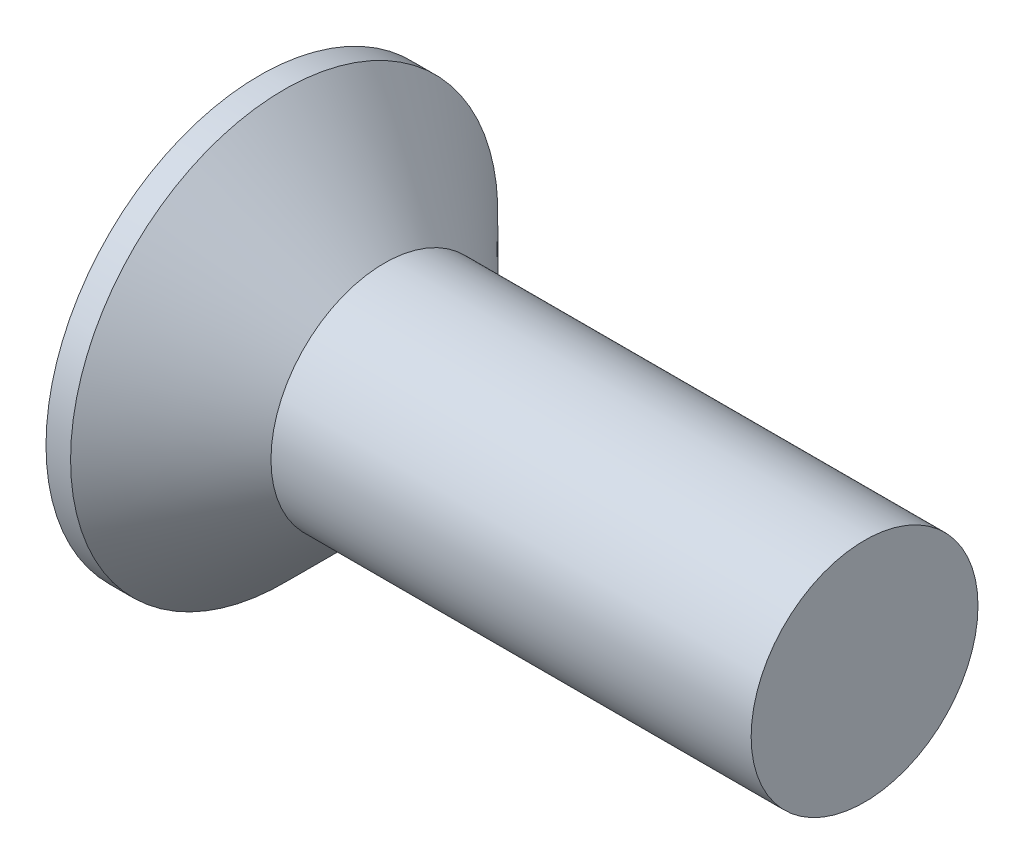
ISO-10303-21;
HEADER;
FILE_DESCRIPTION(('STEP AP214'),'2;1');
FILE_NAME('part.step','',(''),(''),'','','');
FILE_SCHEMA(('AUTOMOTIVE_DESIGN { 1 0 10303 214 1 1 1 1 }'));
ENDSEC;
DATA;
#1=APPLICATION_CONTEXT('core data for automotive mechanical design processes');
#2=APPLICATION_PROTOCOL_DEFINITION('international standard','automotive_design',2000,#1);
#3=PRODUCT_CONTEXT('',#1,'mechanical');
#4=PRODUCT('Part','Part','',(#3));
#5=PRODUCT_RELATED_PRODUCT_CATEGORY('part','',(#4));
#6=PRODUCT_DEFINITION_FORMATION('','',#4);
#7=PRODUCT_DEFINITION_CONTEXT('part definition',#1,'design');
#8=PRODUCT_DEFINITION('design','',#6,#7);
#9=PRODUCT_DEFINITION_SHAPE('','',#8);
#10=(LENGTH_UNIT() NAMED_UNIT(*) SI_UNIT(.MILLI.,.METRE.));
#11=(NAMED_UNIT(*) PLANE_ANGLE_UNIT() SI_UNIT($,.RADIAN.));
#12=(NAMED_UNIT(*) SI_UNIT($,.STERADIAN.) SOLID_ANGLE_UNIT());
#13=UNCERTAINTY_MEASURE_WITH_UNIT(LENGTH_MEASURE(1.E-05),#10,'distance_accuracy_value','');
#14=(GEOMETRIC_REPRESENTATION_CONTEXT(3) GLOBAL_UNCERTAINTY_ASSIGNED_CONTEXT((#13)) GLOBAL_UNIT_ASSIGNED_CONTEXT((#10,
#11,#12)) REPRESENTATION_CONTEXT('',''));
#15=CARTESIAN_POINT('',(0.,0.,0.));
#16=DIRECTION('',(0.,0.,1.));
#17=DIRECTION('',(1.,0.,0.));
#18=AXIS2_PLACEMENT_3D('',#15,#16,#17);
#19=CARTESIAN_POINT('',(0.,5.65,0.));
#20=DIRECTION('',(1.,0.,0.));
#21=DIRECTION('',(0.,0.,-1.));
#22=AXIS2_PLACEMENT_3D('',#19,#20,#21);
#23=PLANE('',#22);
#24=CARTESIAN_POINT('',(0.,0.,0.));
#25=DIRECTION('',(-1.,0.,0.));
#26=DIRECTION('',(0.,0.,1.));
#27=AXIS2_PLACEMENT_3D('',#24,#25,#26);
#28=CIRCLE('',#27,5.65);
#29=CARTESIAN_POINT('',(0.,0.,5.65));
#30=VERTEX_POINT('',#29);
#31=EDGE_CURVE('E45',#30,#30,#28,.T.);
#32=ORIENTED_EDGE('',*,*,#31,.T.);
#33=EDGE_LOOP('',(#32));
#34=FACE_BOUND('',#33,.T.);
#35=ADVANCED_FACE('F31',(#34),#23,.F.);
#36=CARTESIAN_POINT('',(16.,0.,0.));
#37=DIRECTION('',(-1.,0.,0.));
#38=DIRECTION('',(0.,0.,1.));
#39=AXIS2_PLACEMENT_3D('',#36,#37,#38);
#40=PLANE('',#39);
#41=CARTESIAN_POINT('',(16.,0.,0.));
#42=DIRECTION('',(-1.,0.,0.));
#43=DIRECTION('',(0.,0.,1.));
#44=AXIS2_PLACEMENT_3D('',#41,#42,#43);
#45=CIRCLE('',#44,3.);
#46=CARTESIAN_POINT('',(16.,0.,3.));
#47=VERTEX_POINT('',#46);
#48=EDGE_CURVE('E10',#47,#47,#45,.T.);
#49=ORIENTED_EDGE('',*,*,#48,.F.);
#50=EDGE_LOOP('',(#49));
#51=FACE_BOUND('',#50,.T.);
#52=ADVANCED_FACE('F65',(#51),#40,.F.);
#53=CARTESIAN_POINT('',(0.,0.,0.));
#54=DIRECTION('',(-1.,0.,0.));
#55=DIRECTION('',(0.,0.,1.));
#56=AXIS2_PLACEMENT_3D('',#53,#54,#55);
#57=CYLINDRICAL_SURFACE('',#56,3.);
#58=CARTESIAN_POINT('',(3.3,0.,0.));
#59=DIRECTION('',(-1.,0.,0.));
#60=DIRECTION('',(0.,0.,1.));
#61=AXIS2_PLACEMENT_3D('',#58,#59,#60);
#62=CIRCLE('',#61,3.);
#63=CARTESIAN_POINT('',(3.3,0.,3.));
#64=VERTEX_POINT('',#63);
#65=EDGE_CURVE('E37',#64,#64,#62,.T.);
#66=ORIENTED_EDGE('',*,*,#65,.F.);
#67=EDGE_LOOP('',(#66));
#68=FACE_BOUND('',#67,.T.);
#69=ORIENTED_EDGE('',*,*,#48,.T.);
#70=EDGE_LOOP('',(#69));
#71=FACE_BOUND('',#70,.T.);
#72=ADVANCED_FACE('F60',(#68,#71),#57,.T.);
#73=CARTESIAN_POINT('',(3.3,0.,0.));
#74=DIRECTION('',(-1.,0.,0.));
#75=DIRECTION('',(0.,0.,1.));
#76=AXIS2_PLACEMENT_3D('',#73,#74,#75);
#77=CONICAL_SURFACE('',#76,3.,0.78539816339745);
#78=CARTESIAN_POINT('',(0.650000000000007,0.,0.));
#79=DIRECTION('',(-1.,0.,0.));
#80=DIRECTION('',(0.,0.,1.));
#81=AXIS2_PLACEMENT_3D('',#78,#79,#80);
#82=CIRCLE('',#81,5.65);
#83=CARTESIAN_POINT('',(0.650000000000007,0.,5.65));
#84=VERTEX_POINT('',#83);
#85=EDGE_CURVE('E41',#84,#84,#82,.T.);
#86=ORIENTED_EDGE('',*,*,#85,.F.);
#87=EDGE_LOOP('',(#86));
#88=FACE_BOUND('',#87,.T.);
#89=ORIENTED_EDGE('',*,*,#65,.T.);
#90=EDGE_LOOP('',(#89));
#91=FACE_BOUND('',#90,.T.);
#92=ADVANCED_FACE('F55',(#88,#91),#77,.T.);
#93=CARTESIAN_POINT('',(0.,0.,0.));
#94=DIRECTION('',(-1.,0.,0.));
#95=DIRECTION('',(0.,0.,1.));
#96=AXIS2_PLACEMENT_3D('',#93,#94,#95);
#97=CYLINDRICAL_SURFACE('',#96,5.65);
#98=ORIENTED_EDGE('',*,*,#31,.F.);
#99=EDGE_LOOP('',(#98));
#100=FACE_BOUND('',#99,.T.);
#101=ORIENTED_EDGE('',*,*,#85,.T.);
#102=EDGE_LOOP('',(#101));
#103=FACE_BOUND('',#102,.T.);
#104=ADVANCED_FACE('F52',(#100,#103),#97,.T.);
#105=CLOSED_SHELL('',(#35,#52,#72,#92,#104));
#106=MANIFOLD_SOLID_BREP('B2',#105);
#107=ADVANCED_BREP_SHAPE_REPRESENTATION('',(#18,#106),#14);
#108=SHAPE_DEFINITION_REPRESENTATION(#9,#107);
ENDSEC;
END-ISO-10303-21;
